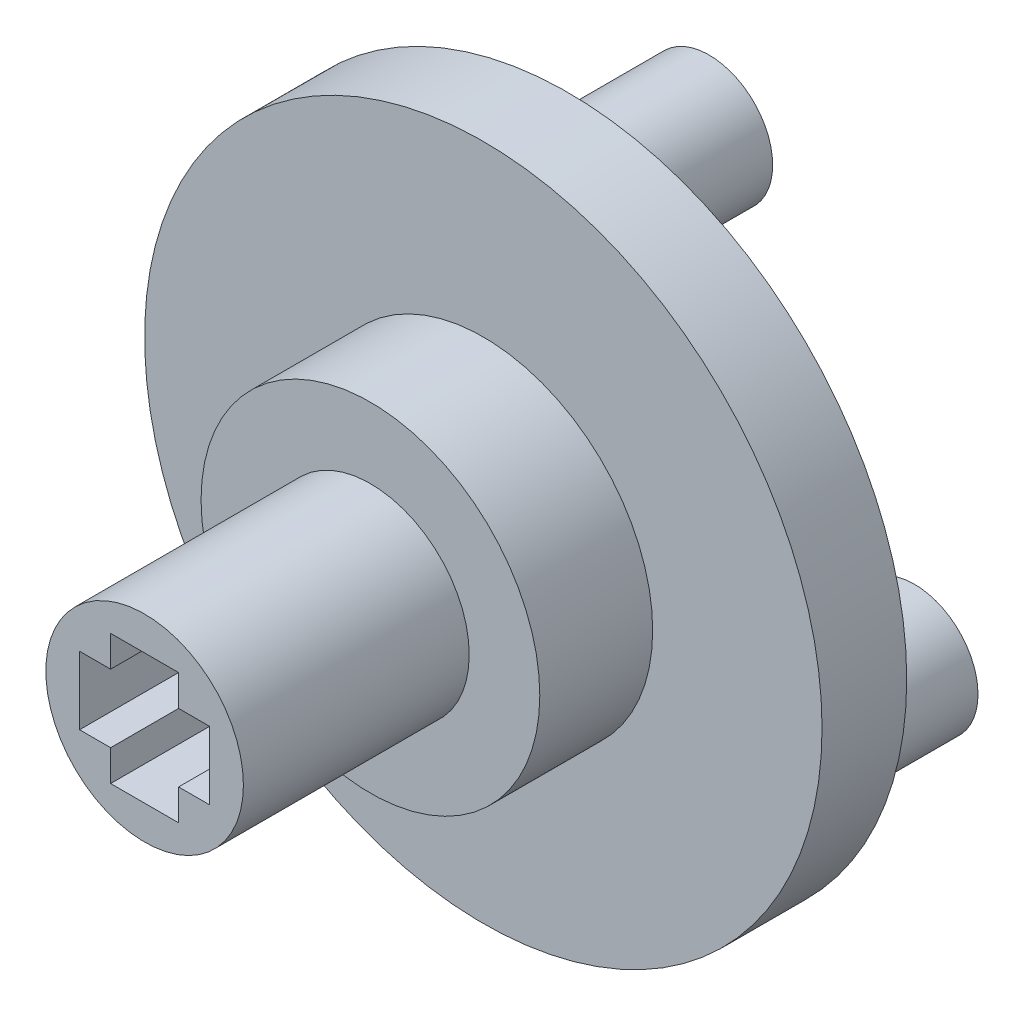
ISO-10303-21;
HEADER;
FILE_DESCRIPTION(('STEP AP214'),'2;1');
FILE_NAME('part.step','',(''),(''),'','','');
FILE_SCHEMA(('AUTOMOTIVE_DESIGN { 1 0 10303 214 1 1 1 1 }'));
ENDSEC;
DATA;
#1=APPLICATION_CONTEXT('core data for automotive mechanical design processes');
#2=APPLICATION_PROTOCOL_DEFINITION('international standard','automotive_design',2000,#1);
#3=PRODUCT_CONTEXT('',#1,'mechanical');
#4=PRODUCT('Part','Part','',(#3));
#5=PRODUCT_RELATED_PRODUCT_CATEGORY('part','',(#4));
#6=PRODUCT_DEFINITION_FORMATION('','',#4);
#7=PRODUCT_DEFINITION_CONTEXT('part definition',#1,'design');
#8=PRODUCT_DEFINITION('design','',#6,#7);
#9=PRODUCT_DEFINITION_SHAPE('','',#8);
#10=(LENGTH_UNIT() NAMED_UNIT(*) SI_UNIT(.MILLI.,.METRE.));
#11=(NAMED_UNIT(*) PLANE_ANGLE_UNIT() SI_UNIT($,.RADIAN.));
#12=(NAMED_UNIT(*) SI_UNIT($,.STERADIAN.) SOLID_ANGLE_UNIT());
#13=UNCERTAINTY_MEASURE_WITH_UNIT(LENGTH_MEASURE(1.E-05),#10,'distance_accuracy_value','');
#14=(GEOMETRIC_REPRESENTATION_CONTEXT(3) GLOBAL_UNCERTAINTY_ASSIGNED_CONTEXT((#13)) GLOBAL_UNIT_ASSIGNED_CONTEXT((#10,
#11,#12)) REPRESENTATION_CONTEXT('',''));
#15=CARTESIAN_POINT('',(0.,0.,0.));
#16=DIRECTION('',(0.,0.,1.));
#17=DIRECTION('',(1.,0.,0.));
#18=AXIS2_PLACEMENT_3D('',#15,#16,#17);
#19=CARTESIAN_POINT('',(0.,0.,3.));
#20=DIRECTION('',(0.,0.,1.));
#21=DIRECTION('',(1.,0.,0.));
#22=AXIS2_PLACEMENT_3D('',#19,#20,#21);
#23=PLANE('',#22);
#24=CARTESIAN_POINT('',(0.,0.,3.));
#25=DIRECTION('',(0.,0.,1.));
#26=DIRECTION('',(1.,0.,0.));
#27=AXIS2_PLACEMENT_3D('',#24,#25,#26);
#28=CIRCLE('',#27,12.);
#29=CARTESIAN_POINT('',(12.,0.,3.));
#30=VERTEX_POINT('',#29);
#31=EDGE_CURVE('E12',#30,#30,#28,.T.);
#32=ORIENTED_EDGE('',*,*,#31,.T.);
#33=EDGE_LOOP('',(#32));
#34=FACE_BOUND('',#33,.T.);
#35=CARTESIAN_POINT('',(0.,0.,3.));
#36=DIRECTION('',(0.,0.,1.));
#37=DIRECTION('',(1.,0.,0.));
#38=AXIS2_PLACEMENT_3D('',#35,#36,#37);
#39=CIRCLE('',#38,6.);
#40=CARTESIAN_POINT('',(6.,0.,3.));
#41=VERTEX_POINT('',#40);
#42=EDGE_CURVE('E267',#41,#41,#39,.T.);
#43=ORIENTED_EDGE('',*,*,#42,.F.);
#44=EDGE_LOOP('',(#43));
#45=FACE_BOUND('',#44,.T.);
#46=ADVANCED_FACE('F53',(#34,#45),#23,.T.);
#47=CARTESIAN_POINT('',(0.,0.,0.));
#48=DIRECTION('',(0.,0.,1.));
#49=DIRECTION('',(1.,0.,0.));
#50=AXIS2_PLACEMENT_3D('',#47,#48,#49);
#51=PLANE('',#50);
#52=CARTESIAN_POINT('',(-7.27461339178875,-4.20000000000031,0.));
#53=DIRECTION('',(0.,0.,1.));
#54=DIRECTION('',(1.,0.,0.));
#55=AXIS2_PLACEMENT_3D('',#52,#53,#54);
#56=CIRCLE('',#55,2.25000000000068);
#57=CARTESIAN_POINT('',(-5.02461339178807,-4.20000000000031,0.));
#58=VERTEX_POINT('',#57);
#59=EDGE_CURVE('E271',#58,#58,#56,.T.);
#60=ORIENTED_EDGE('',*,*,#59,.T.);
#61=EDGE_LOOP('',(#60));
#62=FACE_BOUND('',#61,.T.);
#63=CARTESIAN_POINT('',(7.27461339178982,-4.19999999999969,0.));
#64=DIRECTION('',(0.,0.,1.));
#65=DIRECTION('',(1.,0.,0.));
#66=AXIS2_PLACEMENT_3D('',#63,#64,#65);
#67=CIRCLE('',#66,2.25000000000046);
#68=CARTESIAN_POINT('',(9.52461339179028,-4.19999999999969,0.));
#69=VERTEX_POINT('',#68);
#70=EDGE_CURVE('E276',#69,#69,#67,.T.);
#71=ORIENTED_EDGE('',*,*,#70,.T.);
#72=EDGE_LOOP('',(#71));
#73=FACE_BOUND('',#72,.T.);
#74=CARTESIAN_POINT('',(0.,8.4,0.));
#75=DIRECTION('',(0.,0.,1.));
#76=DIRECTION('',(1.,0.,0.));
#77=AXIS2_PLACEMENT_3D('',#74,#75,#76);
#78=CIRCLE('',#77,2.25);
#79=CARTESIAN_POINT('',(2.25,8.4,0.));
#80=VERTEX_POINT('',#79);
#81=EDGE_CURVE('E284',#80,#80,#78,.T.);
#82=ORIENTED_EDGE('',*,*,#81,.T.);
#83=EDGE_LOOP('',(#82));
#84=FACE_BOUND('',#83,.T.);
#85=CARTESIAN_POINT('',(0.,0.,0.));
#86=DIRECTION('',(0.,0.,1.));
#87=DIRECTION('',(1.,0.,0.));
#88=AXIS2_PLACEMENT_3D('',#85,#86,#87);
#89=CIRCLE('',#88,12.);
#90=CARTESIAN_POINT('',(12.,0.,0.));
#91=VERTEX_POINT('',#90);
#92=EDGE_CURVE('E57',#91,#91,#89,.T.);
#93=ORIENTED_EDGE('',*,*,#92,.F.);
#94=EDGE_LOOP('',(#93));
#95=FACE_BOUND('',#94,.T.);
#96=CARTESIAN_POINT('',(0.,0.,0.));
#97=DIRECTION('',(0.,0.,1.));
#98=DIRECTION('',(1.,0.,0.));
#99=AXIS2_PLACEMENT_3D('',#96,#97,#98);
#100=CIRCLE('',#99,2.);
#101=CARTESIAN_POINT('',(2.,0.,0.));
#102=VERTEX_POINT('',#101);
#103=EDGE_CURVE('E292',#102,#102,#100,.T.);
#104=ORIENTED_EDGE('',*,*,#103,.T.);
#105=EDGE_LOOP('',(#104));
#106=FACE_BOUND('',#105,.T.);
#107=ADVANCED_FACE('F305',(#62,#73,#84,#95,#106),#51,.F.);
#108=CARTESIAN_POINT('',(0.,0.,3.));
#109=DIRECTION('',(0.,0.,-1.));
#110=DIRECTION('',(-1.,0.,0.));
#111=AXIS2_PLACEMENT_3D('',#108,#109,#110);
#112=CYLINDRICAL_SURFACE('',#111,12.);
#113=ORIENTED_EDGE('',*,*,#31,.F.);
#114=EDGE_LOOP('',(#113));
#115=FACE_BOUND('',#114,.T.);
#116=ORIENTED_EDGE('',*,*,#92,.T.);
#117=EDGE_LOOP('',(#116));
#118=FACE_BOUND('',#117,.T.);
#119=ADVANCED_FACE('F55',(#115,#118),#112,.T.);
#120=CARTESIAN_POINT('',(0.,0.,3.));
#121=DIRECTION('',(0.,0.,-1.));
#122=DIRECTION('',(-1.,0.,0.));
#123=AXIS2_PLACEMENT_3D('',#120,#121,#122);
#124=CYLINDRICAL_SURFACE('',#123,2.);
#125=ORIENTED_EDGE('',*,*,#103,.F.);
#126=EDGE_LOOP('',(#125));
#127=FACE_BOUND('',#126,.T.);
#128=CARTESIAN_POINT('',(0.,0.,6.));
#129=DIRECTION('',(0.,0.,1.));
#130=DIRECTION('',(1.,0.,0.));
#131=AXIS2_PLACEMENT_3D('',#128,#129,#130);
#132=CIRCLE('',#131,2.);
#133=CARTESIAN_POINT('',(2.,0.,6.));
#134=VERTEX_POINT('',#133);
#135=EDGE_CURVE('E263',#134,#134,#132,.T.);
#136=ORIENTED_EDGE('',*,*,#135,.T.);
#137=EDGE_LOOP('',(#136));
#138=FACE_BOUND('',#137,.T.);
#139=ADVANCED_FACE('F312',(#127,#138),#124,.F.);
#140=CARTESIAN_POINT('',(0.,8.4,-5.));
#141=DIRECTION('',(0.,0.,1.));
#142=DIRECTION('',(1.,0.,0.));
#143=AXIS2_PLACEMENT_3D('',#140,#141,#142);
#144=CYLINDRICAL_SURFACE('',#143,2.25);
#145=CARTESIAN_POINT('',(0.,8.4,-5.));
#146=DIRECTION('',(0.,0.,1.));
#147=DIRECTION('',(1.,0.,0.));
#148=AXIS2_PLACEMENT_3D('',#145,#146,#147);
#149=CIRCLE('',#148,2.25);
#150=CARTESIAN_POINT('',(2.25,8.4,-5.));
#151=VERTEX_POINT('',#150);
#152=EDGE_CURVE('E288',#151,#151,#149,.T.);
#153=ORIENTED_EDGE('',*,*,#152,.T.);
#154=EDGE_LOOP('',(#153));
#155=FACE_BOUND('',#154,.T.);
#156=ORIENTED_EDGE('',*,*,#81,.F.);
#157=EDGE_LOOP('',(#156));
#158=FACE_BOUND('',#157,.T.);
#159=ADVANCED_FACE('F320',(#155,#158),#144,.T.);
#160=CARTESIAN_POINT('',(0.,0.,-5.));
#161=DIRECTION('',(0.,0.,1.));
#162=DIRECTION('',(1.,0.,0.));
#163=AXIS2_PLACEMENT_3D('',#160,#161,#162);
#164=PLANE('',#163);
#165=ORIENTED_EDGE('',*,*,#152,.F.);
#166=EDGE_LOOP('',(#165));
#167=FACE_BOUND('',#166,.T.);
#168=ADVANCED_FACE('F324',(#167),#164,.F.);
#169=CARTESIAN_POINT('',(7.27461339178982,-4.19999999999969,-5.));
#170=DIRECTION('',(0.,0.,1.));
#171=DIRECTION('',(1.,0.,0.));
#172=AXIS2_PLACEMENT_3D('',#169,#170,#171);
#173=CYLINDRICAL_SURFACE('',#172,2.25000000000046);
#174=CARTESIAN_POINT('',(7.27461339178982,-4.19999999999969,-5.));
#175=DIRECTION('',(0.,0.,1.));
#176=DIRECTION('',(1.,0.,0.));
#177=AXIS2_PLACEMENT_3D('',#174,#175,#176);
#178=CIRCLE('',#177,2.25000000000046);
#179=CARTESIAN_POINT('',(9.52461339179028,-4.19999999999969,-5.));
#180=VERTEX_POINT('',#179);
#181=EDGE_CURVE('E280',#180,#180,#178,.T.);
#182=ORIENTED_EDGE('',*,*,#181,.T.);
#183=EDGE_LOOP('',(#182));
#184=FACE_BOUND('',#183,.T.);
#185=ORIENTED_EDGE('',*,*,#70,.F.);
#186=EDGE_LOOP('',(#185));
#187=FACE_BOUND('',#186,.T.);
#188=ADVANCED_FACE('F328',(#184,#187),#173,.T.);
#189=CARTESIAN_POINT('',(0.,0.,-5.));
#190=DIRECTION('',(0.,0.,1.));
#191=DIRECTION('',(1.,0.,0.));
#192=AXIS2_PLACEMENT_3D('',#189,#190,#191);
#193=PLANE('',#192);
#194=ORIENTED_EDGE('',*,*,#181,.F.);
#195=EDGE_LOOP('',(#194));
#196=FACE_BOUND('',#195,.T.);
#197=ADVANCED_FACE('F332',(#196),#193,.F.);
#198=CARTESIAN_POINT('',(-7.27461339178875,-4.20000000000031,-5.));
#199=DIRECTION('',(0.,0.,1.));
#200=DIRECTION('',(1.,0.,0.));
#201=AXIS2_PLACEMENT_3D('',#198,#199,#200);
#202=CYLINDRICAL_SURFACE('',#201,2.25000000000068);
#203=CARTESIAN_POINT('',(-7.27461339178875,-4.20000000000031,-5.));
#204=DIRECTION('',(0.,0.,1.));
#205=DIRECTION('',(1.,0.,0.));
#206=AXIS2_PLACEMENT_3D('',#203,#204,#205);
#207=CIRCLE('',#206,2.25000000000068);
#208=CARTESIAN_POINT('',(-5.02461339178807,-4.20000000000031,-5.));
#209=VERTEX_POINT('',#208);
#210=EDGE_CURVE('E272',#209,#209,#207,.T.);
#211=ORIENTED_EDGE('',*,*,#210,.T.);
#212=EDGE_LOOP('',(#211));
#213=FACE_BOUND('',#212,.T.);
#214=ORIENTED_EDGE('',*,*,#59,.F.);
#215=EDGE_LOOP('',(#214));
#216=FACE_BOUND('',#215,.T.);
#217=ADVANCED_FACE('F336',(#213,#216),#202,.T.);
#218=CARTESIAN_POINT('',(0.,0.,-5.));
#219=DIRECTION('',(0.,0.,1.));
#220=DIRECTION('',(1.,0.,0.));
#221=AXIS2_PLACEMENT_3D('',#218,#219,#220);
#222=PLANE('',#221);
#223=ORIENTED_EDGE('',*,*,#210,.F.);
#224=EDGE_LOOP('',(#223));
#225=FACE_BOUND('',#224,.T.);
#226=ADVANCED_FACE('F340',(#225),#222,.F.);
#227=CARTESIAN_POINT('',(0.,0.,6.));
#228=DIRECTION('',(0.,0.,-1.));
#229=DIRECTION('',(-1.,0.,0.));
#230=AXIS2_PLACEMENT_3D('',#227,#228,#229);
#231=CYLINDRICAL_SURFACE('',#230,6.);
#232=ORIENTED_EDGE('',*,*,#42,.T.);
#233=EDGE_LOOP('',(#232));
#234=FACE_BOUND('',#233,.T.);
#235=CARTESIAN_POINT('',(0.,0.,7.));
#236=DIRECTION('',(0.,0.,1.));
#237=DIRECTION('',(1.,0.,0.));
#238=AXIS2_PLACEMENT_3D('',#235,#236,#237);
#239=CIRCLE('',#238,6.);
#240=CARTESIAN_POINT('',(6.,0.,7.));
#241=VERTEX_POINT('',#240);
#242=EDGE_CURVE('E259',#241,#241,#239,.T.);
#243=ORIENTED_EDGE('',*,*,#242,.F.);
#244=EDGE_LOOP('',(#243));
#245=FACE_BOUND('',#244,.T.);
#246=ADVANCED_FACE('F344',(#234,#245),#231,.T.);
#247=CARTESIAN_POINT('',(0.,0.,6.));
#248=DIRECTION('',(0.,0.,1.));
#249=DIRECTION('',(1.,0.,0.));
#250=AXIS2_PLACEMENT_3D('',#247,#248,#249);
#251=PLANE('',#250);
#252=ORIENTED_EDGE('',*,*,#135,.F.);
#253=EDGE_LOOP('',(#252));
#254=FACE_BOUND('',#253,.T.);
#255=ADVANCED_FACE('F348',(#254),#251,.F.);
#256=CARTESIAN_POINT('',(0.,0.,7.));
#257=DIRECTION('',(0.,0.,1.));
#258=DIRECTION('',(1.,0.,0.));
#259=AXIS2_PLACEMENT_3D('',#256,#257,#258);
#260=PLANE('',#259);
#261=CARTESIAN_POINT('',(0.,0.,7.));
#262=DIRECTION('',(0.,0.,1.));
#263=DIRECTION('',(1.,0.,0.));
#264=AXIS2_PLACEMENT_3D('',#261,#262,#263);
#265=CIRCLE('',#264,3.5);
#266=CARTESIAN_POINT('',(3.5,0.,7.));
#267=VERTEX_POINT('',#266);
#268=EDGE_CURVE('E225',#267,#267,#265,.T.);
#269=ORIENTED_EDGE('',*,*,#268,.F.);
#270=EDGE_LOOP('',(#269));
#271=FACE_BOUND('',#270,.T.);
#272=ORIENTED_EDGE('',*,*,#242,.T.);
#273=EDGE_LOOP('',(#272));
#274=FACE_BOUND('',#273,.T.);
#275=ADVANCED_FACE('F352',(#271,#274),#260,.T.);
#276=CARTESIAN_POINT('',(0.,2.30428047928488,15.));
#277=DIRECTION('',(0.,1.,0.));
#278=DIRECTION('',(0.,0.,1.));
#279=AXIS2_PLACEMENT_3D('',#276,#277,#278);
#280=PLANE('',#279);
#281=DIRECTION('',(1.,0.,0.));
#282=VECTOR('',#281,1.);
#283=CARTESIAN_POINT('',(0.,2.30428047928488,7.));
#284=LINE('',#283,#282);
#285=CARTESIAN_POINT('',(-1.20428047928488,2.30428047928488,7.));
#286=VERTEX_POINT('',#285);
#287=CARTESIAN_POINT('',(1.20428047928488,2.30428047928488,7.));
#288=VERTEX_POINT('',#287);
#289=EDGE_CURVE('E182',#286,#288,#284,.T.);
#290=ORIENTED_EDGE('',*,*,#289,.T.);
#291=DIRECTION('',(0.,0.,-1.));
#292=VECTOR('',#291,1.);
#293=CARTESIAN_POINT('',(1.20428047928488,2.30428047928488,15.));
#294=LINE('',#293,#292);
#295=CARTESIAN_POINT('',(1.20428047928488,2.30428047928488,15.));
#296=VERTEX_POINT('',#295);
#297=EDGE_CURVE('E256',#296,#288,#294,.T.);
#298=ORIENTED_EDGE('',*,*,#297,.F.);
#299=DIRECTION('',(1.,0.,0.));
#300=VECTOR('',#299,1.);
#301=CARTESIAN_POINT('',(0.,2.30428047928488,15.));
#302=LINE('',#301,#300);
#303=CARTESIAN_POINT('',(-1.20428047928488,2.30428047928488,15.));
#304=VERTEX_POINT('',#303);
#305=EDGE_CURVE('E121',#304,#296,#302,.T.);
#306=ORIENTED_EDGE('',*,*,#305,.F.);
#307=DIRECTION('',(0.,0.,-1.));
#308=VECTOR('',#307,1.);
#309=CARTESIAN_POINT('',(-1.20428047928488,2.30428047928488,15.));
#310=LINE('',#309,#308);
#311=EDGE_CURVE('E181',#304,#286,#310,.T.);
#312=ORIENTED_EDGE('',*,*,#311,.T.);
#313=EDGE_LOOP('',(#290,#298,#306,#312));
#314=FACE_BOUND('',#313,.T.);
#315=ADVANCED_FACE('F356',(#314),#280,.F.);
#316=CARTESIAN_POINT('',(1.20428047928488,0.,15.));
#317=DIRECTION('',(-1.,0.,0.));
#318=DIRECTION('',(0.,0.,1.));
#319=AXIS2_PLACEMENT_3D('',#316,#317,#318);
#320=PLANE('',#319);
#321=DIRECTION('',(0.,1.,0.));
#322=VECTOR('',#321,1.);
#323=CARTESIAN_POINT('',(1.20428047928488,0.,7.));
#324=LINE('',#323,#322);
#325=CARTESIAN_POINT('',(1.20428047928488,1.20428047928488,7.));
#326=VERTEX_POINT('',#325);
#327=EDGE_CURVE('E186',#326,#288,#324,.T.);
#328=ORIENTED_EDGE('',*,*,#327,.F.);
#329=DIRECTION('',(0.,0.,-1.));
#330=VECTOR('',#329,1.);
#331=CARTESIAN_POINT('',(1.20428047928488,1.20428047928488,15.));
#332=LINE('',#331,#330);
#333=CARTESIAN_POINT('',(1.20428047928488,1.20428047928488,15.));
#334=VERTEX_POINT('',#333);
#335=EDGE_CURVE('E253',#334,#326,#332,.T.);
#336=ORIENTED_EDGE('',*,*,#335,.F.);
#337=DIRECTION('',(0.,1.,0.));
#338=VECTOR('',#337,1.);
#339=CARTESIAN_POINT('',(1.20428047928488,0.,15.));
#340=LINE('',#339,#338);
#341=EDGE_CURVE('E417',#334,#296,#340,.T.);
#342=ORIENTED_EDGE('',*,*,#341,.T.);
#343=ORIENTED_EDGE('',*,*,#297,.T.);
#344=EDGE_LOOP('',(#328,#336,#342,#343));
#345=FACE_BOUND('',#344,.T.);
#346=ADVANCED_FACE('F361',(#345),#320,.T.);
#347=CARTESIAN_POINT('',(0.,1.20428047928488,15.));
#348=DIRECTION('',(0.,1.,0.));
#349=DIRECTION('',(0.,0.,1.));
#350=AXIS2_PLACEMENT_3D('',#347,#348,#349);
#351=PLANE('',#350);
#352=DIRECTION('',(1.,0.,0.));
#353=VECTOR('',#352,1.);
#354=CARTESIAN_POINT('',(0.,1.20428047928488,7.));
#355=LINE('',#354,#353);
#356=CARTESIAN_POINT('',(2.30428047928488,1.20428047928488,7.));
#357=VERTEX_POINT('',#356);
#358=EDGE_CURVE('E190',#326,#357,#355,.T.);
#359=ORIENTED_EDGE('',*,*,#358,.T.);
#360=DIRECTION('',(0.,0.,-1.));
#361=VECTOR('',#360,1.);
#362=CARTESIAN_POINT('',(2.30428047928488,1.20428047928488,15.));
#363=LINE('',#362,#361);
#364=CARTESIAN_POINT('',(2.30428047928488,1.20428047928488,15.));
#365=VERTEX_POINT('',#364);
#366=EDGE_CURVE('E250',#365,#357,#363,.T.);
#367=ORIENTED_EDGE('',*,*,#366,.F.);
#368=DIRECTION('',(1.,0.,0.));
#369=VECTOR('',#368,1.);
#370=CARTESIAN_POINT('',(0.,1.20428047928488,15.));
#371=LINE('',#370,#369);
#372=EDGE_CURVE('E421',#334,#365,#371,.T.);
#373=ORIENTED_EDGE('',*,*,#372,.F.);
#374=ORIENTED_EDGE('',*,*,#335,.T.);
#375=EDGE_LOOP('',(#359,#367,#373,#374));
#376=FACE_BOUND('',#375,.T.);
#377=ADVANCED_FACE('F365',(#376),#351,.F.);
#378=CARTESIAN_POINT('',(2.30428047928488,0.,15.));
#379=DIRECTION('',(-1.,0.,0.));
#380=DIRECTION('',(0.,0.,1.));
#381=AXIS2_PLACEMENT_3D('',#378,#379,#380);
#382=PLANE('',#381);
#383=DIRECTION('',(0.,1.,0.));
#384=VECTOR('',#383,1.);
#385=CARTESIAN_POINT('',(2.30428047928488,0.,7.));
#386=LINE('',#385,#384);
#387=CARTESIAN_POINT('',(2.30428047928488,-1.20428047928488,7.));
#388=VERTEX_POINT('',#387);
#389=EDGE_CURVE('E194',#388,#357,#386,.T.);
#390=ORIENTED_EDGE('',*,*,#389,.F.);
#391=DIRECTION('',(0.,0.,-1.));
#392=VECTOR('',#391,1.);
#393=CARTESIAN_POINT('',(2.30428047928488,-1.20428047928488,15.));
#394=LINE('',#393,#392);
#395=CARTESIAN_POINT('',(2.30428047928488,-1.20428047928488,15.));
#396=VERTEX_POINT('',#395);
#397=EDGE_CURVE('E247',#396,#388,#394,.T.);
#398=ORIENTED_EDGE('',*,*,#397,.F.);
#399=DIRECTION('',(0.,1.,0.));
#400=VECTOR('',#399,1.);
#401=CARTESIAN_POINT('',(2.30428047928488,0.,15.));
#402=LINE('',#401,#400);
#403=EDGE_CURVE('E426',#396,#365,#402,.T.);
#404=ORIENTED_EDGE('',*,*,#403,.T.);
#405=ORIENTED_EDGE('',*,*,#366,.T.);
#406=EDGE_LOOP('',(#390,#398,#404,#405));
#407=FACE_BOUND('',#406,.T.);
#408=ADVANCED_FACE('F369',(#407),#382,.T.);
#409=CARTESIAN_POINT('',(0.,-1.20428047928488,15.));
#410=DIRECTION('',(0.,1.,0.));
#411=DIRECTION('',(0.,0.,1.));
#412=AXIS2_PLACEMENT_3D('',#409,#410,#411);
#413=PLANE('',#412);
#414=DIRECTION('',(1.,0.,0.));
#415=VECTOR('',#414,1.);
#416=CARTESIAN_POINT('',(0.,-1.20428047928488,7.));
#417=LINE('',#416,#415);
#418=CARTESIAN_POINT('',(1.20428047928488,-1.20428047928488,7.));
#419=VERTEX_POINT('',#418);
#420=EDGE_CURVE('E198',#419,#388,#417,.T.);
#421=ORIENTED_EDGE('',*,*,#420,.F.);
#422=DIRECTION('',(0.,0.,-1.));
#423=VECTOR('',#422,1.);
#424=CARTESIAN_POINT('',(1.20428047928488,-1.20428047928488,15.));
#425=LINE('',#424,#423);
#426=CARTESIAN_POINT('',(1.20428047928488,-1.20428047928488,15.));
#427=VERTEX_POINT('',#426);
#428=EDGE_CURVE('E244',#427,#419,#425,.T.);
#429=ORIENTED_EDGE('',*,*,#428,.F.);
#430=DIRECTION('',(1.,0.,0.));
#431=VECTOR('',#430,1.);
#432=CARTESIAN_POINT('',(0.,-1.20428047928488,15.));
#433=LINE('',#432,#431);
#434=EDGE_CURVE('E430',#427,#396,#433,.T.);
#435=ORIENTED_EDGE('',*,*,#434,.T.);
#436=ORIENTED_EDGE('',*,*,#397,.T.);
#437=EDGE_LOOP('',(#421,#429,#435,#436));
#438=FACE_BOUND('',#437,.T.);
#439=ADVANCED_FACE('F373',(#438),#413,.T.);
#440=CARTESIAN_POINT('',(1.20428047928488,0.,15.));
#441=DIRECTION('',(-1.,0.,0.));
#442=DIRECTION('',(0.,0.,1.));
#443=AXIS2_PLACEMENT_3D('',#440,#441,#442);
#444=PLANE('',#443);
#445=DIRECTION('',(0.,1.,0.));
#446=VECTOR('',#445,1.);
#447=CARTESIAN_POINT('',(1.20428047928488,0.,7.));
#448=LINE('',#447,#446);
#449=CARTESIAN_POINT('',(1.20428047928488,-2.30428047928488,7.));
#450=VERTEX_POINT('',#449);
#451=EDGE_CURVE('E202',#450,#419,#448,.T.);
#452=ORIENTED_EDGE('',*,*,#451,.F.);
#453=DIRECTION('',(0.,0.,-1.));
#454=VECTOR('',#453,1.);
#455=CARTESIAN_POINT('',(1.20428047928488,-2.30428047928488,15.));
#456=LINE('',#455,#454);
#457=CARTESIAN_POINT('',(1.20428047928488,-2.30428047928488,15.));
#458=VERTEX_POINT('',#457);
#459=EDGE_CURVE('E241',#458,#450,#456,.T.);
#460=ORIENTED_EDGE('',*,*,#459,.F.);
#461=DIRECTION('',(0.,1.,0.));
#462=VECTOR('',#461,1.);
#463=CARTESIAN_POINT('',(1.20428047928488,0.,15.));
#464=LINE('',#463,#462);
#465=EDGE_CURVE('E434',#458,#427,#464,.T.);
#466=ORIENTED_EDGE('',*,*,#465,.T.);
#467=ORIENTED_EDGE('',*,*,#428,.T.);
#468=EDGE_LOOP('',(#452,#460,#466,#467));
#469=FACE_BOUND('',#468,.T.);
#470=ADVANCED_FACE('F377',(#469),#444,.T.);
#471=CARTESIAN_POINT('',(0.,-2.30428047928488,15.));
#472=DIRECTION('',(0.,1.,0.));
#473=DIRECTION('',(0.,0.,1.));
#474=AXIS2_PLACEMENT_3D('',#471,#472,#473);
#475=PLANE('',#474);
#476=DIRECTION('',(1.,0.,0.));
#477=VECTOR('',#476,1.);
#478=CARTESIAN_POINT('',(0.,-2.30428047928488,7.));
#479=LINE('',#478,#477);
#480=CARTESIAN_POINT('',(-1.20428047928488,-2.30428047928488,7.));
#481=VERTEX_POINT('',#480);
#482=EDGE_CURVE('E206',#481,#450,#479,.T.);
#483=ORIENTED_EDGE('',*,*,#482,.F.);
#484=DIRECTION('',(0.,0.,-1.));
#485=VECTOR('',#484,1.);
#486=CARTESIAN_POINT('',(-1.20428047928488,-2.30428047928488,15.));
#487=LINE('',#486,#485);
#488=CARTESIAN_POINT('',(-1.20428047928488,-2.30428047928488,15.));
#489=VERTEX_POINT('',#488);
#490=EDGE_CURVE('E238',#489,#481,#487,.T.);
#491=ORIENTED_EDGE('',*,*,#490,.F.);
#492=DIRECTION('',(1.,0.,0.));
#493=VECTOR('',#492,1.);
#494=CARTESIAN_POINT('',(0.,-2.30428047928488,15.));
#495=LINE('',#494,#493);
#496=EDGE_CURVE('E438',#489,#458,#495,.T.);
#497=ORIENTED_EDGE('',*,*,#496,.T.);
#498=ORIENTED_EDGE('',*,*,#459,.T.);
#499=EDGE_LOOP('',(#483,#491,#497,#498));
#500=FACE_BOUND('',#499,.T.);
#501=ADVANCED_FACE('F381',(#500),#475,.T.);
#502=CARTESIAN_POINT('',(-1.20428047928488,0.,15.));
#503=DIRECTION('',(-1.,0.,0.));
#504=DIRECTION('',(0.,0.,1.));
#505=AXIS2_PLACEMENT_3D('',#502,#503,#504);
#506=PLANE('',#505);
#507=DIRECTION('',(0.,1.,0.));
#508=VECTOR('',#507,1.);
#509=CARTESIAN_POINT('',(-1.20428047928488,0.,7.));
#510=LINE('',#509,#508);
#511=CARTESIAN_POINT('',(-1.20428047928488,-1.20428047928488,7.));
#512=VERTEX_POINT('',#511);
#513=EDGE_CURVE('E210',#481,#512,#510,.T.);
#514=ORIENTED_EDGE('',*,*,#513,.T.);
#515=DIRECTION('',(0.,0.,-1.));
#516=VECTOR('',#515,1.);
#517=CARTESIAN_POINT('',(-1.20428047928488,-1.20428047928488,15.));
#518=LINE('',#517,#516);
#519=CARTESIAN_POINT('',(-1.20428047928488,-1.20428047928488,15.));
#520=VERTEX_POINT('',#519);
#521=EDGE_CURVE('E235',#520,#512,#518,.T.);
#522=ORIENTED_EDGE('',*,*,#521,.F.);
#523=DIRECTION('',(0.,1.,0.));
#524=VECTOR('',#523,1.);
#525=CARTESIAN_POINT('',(-1.20428047928488,0.,15.));
#526=LINE('',#525,#524);
#527=EDGE_CURVE('E442',#489,#520,#526,.T.);
#528=ORIENTED_EDGE('',*,*,#527,.F.);
#529=ORIENTED_EDGE('',*,*,#490,.T.);
#530=EDGE_LOOP('',(#514,#522,#528,#529));
#531=FACE_BOUND('',#530,.T.);
#532=ADVANCED_FACE('F385',(#531),#506,.F.);
#533=CARTESIAN_POINT('',(0.,-1.20428047928488,15.));
#534=DIRECTION('',(0.,1.,0.));
#535=DIRECTION('',(0.,0.,1.));
#536=AXIS2_PLACEMENT_3D('',#533,#534,#535);
#537=PLANE('',#536);
#538=DIRECTION('',(1.,0.,0.));
#539=VECTOR('',#538,1.);
#540=CARTESIAN_POINT('',(0.,-1.20428047928488,7.));
#541=LINE('',#540,#539);
#542=CARTESIAN_POINT('',(-2.30428047928488,-1.20428047928488,7.));
#543=VERTEX_POINT('',#542);
#544=EDGE_CURVE('E214',#543,#512,#541,.T.);
#545=ORIENTED_EDGE('',*,*,#544,.F.);
#546=DIRECTION('',(0.,0.,-1.));
#547=VECTOR('',#546,1.);
#548=CARTESIAN_POINT('',(-2.30428047928488,-1.20428047928488,15.));
#549=LINE('',#548,#547);
#550=CARTESIAN_POINT('',(-2.30428047928488,-1.20428047928488,15.));
#551=VERTEX_POINT('',#550);
#552=EDGE_CURVE('E168',#551,#543,#549,.T.);
#553=ORIENTED_EDGE('',*,*,#552,.F.);
#554=DIRECTION('',(1.,0.,0.));
#555=VECTOR('',#554,1.);
#556=CARTESIAN_POINT('',(0.,-1.20428047928488,15.));
#557=LINE('',#556,#555);
#558=EDGE_CURVE('E156',#551,#520,#557,.T.);
#559=ORIENTED_EDGE('',*,*,#558,.T.);
#560=ORIENTED_EDGE('',*,*,#521,.T.);
#561=EDGE_LOOP('',(#545,#553,#559,#560));
#562=FACE_BOUND('',#561,.T.);
#563=ADVANCED_FACE('F389',(#562),#537,.T.);
#564=CARTESIAN_POINT('',(-2.30428047928488,0.,15.));
#565=DIRECTION('',(-1.,0.,0.));
#566=DIRECTION('',(0.,0.,1.));
#567=AXIS2_PLACEMENT_3D('',#564,#565,#566);
#568=PLANE('',#567);
#569=DIRECTION('',(0.,1.,0.));
#570=VECTOR('',#569,1.);
#571=CARTESIAN_POINT('',(-2.30428047928488,0.,7.));
#572=LINE('',#571,#570);
#573=CARTESIAN_POINT('',(-2.30428047928488,1.20428047928488,7.));
#574=VERTEX_POINT('',#573);
#575=EDGE_CURVE('E164',#543,#574,#572,.T.);
#576=ORIENTED_EDGE('',*,*,#575,.T.);
#577=DIRECTION('',(0.,0.,-1.));
#578=VECTOR('',#577,1.);
#579=CARTESIAN_POINT('',(-2.30428047928488,1.20428047928488,15.));
#580=LINE('',#579,#578);
#581=CARTESIAN_POINT('',(-2.30428047928488,1.20428047928488,15.));
#582=VERTEX_POINT('',#581);
#583=EDGE_CURVE('E161',#582,#574,#580,.T.);
#584=ORIENTED_EDGE('',*,*,#583,.F.);
#585=DIRECTION('',(0.,1.,0.));
#586=VECTOR('',#585,1.);
#587=CARTESIAN_POINT('',(-2.30428047928488,0.,15.));
#588=LINE('',#587,#586);
#589=EDGE_CURVE('E149',#551,#582,#588,.T.);
#590=ORIENTED_EDGE('',*,*,#589,.F.);
#591=ORIENTED_EDGE('',*,*,#552,.T.);
#592=EDGE_LOOP('',(#576,#584,#590,#591));
#593=FACE_BOUND('',#592,.T.);
#594=ADVANCED_FACE('F162',(#593),#568,.F.);
#595=CARTESIAN_POINT('',(0.,1.20428047928488,15.));
#596=DIRECTION('',(0.,1.,0.));
#597=DIRECTION('',(0.,0.,1.));
#598=AXIS2_PLACEMENT_3D('',#595,#596,#597);
#599=PLANE('',#598);
#600=DIRECTION('',(1.,0.,0.));
#601=VECTOR('',#600,1.);
#602=CARTESIAN_POINT('',(0.,1.20428047928488,7.));
#603=LINE('',#602,#601);
#604=CARTESIAN_POINT('',(-1.20428047928488,1.20428047928488,7.));
#605=VERTEX_POINT('',#604);
#606=EDGE_CURVE('E220',#574,#605,#603,.T.);
#607=ORIENTED_EDGE('',*,*,#606,.T.);
#608=DIRECTION('',(0.,0.,-1.));
#609=VECTOR('',#608,1.);
#610=CARTESIAN_POINT('',(-1.20428047928488,1.20428047928488,15.));
#611=LINE('',#610,#609);
#612=CARTESIAN_POINT('',(-1.20428047928488,1.20428047928488,15.));
#613=VERTEX_POINT('',#612);
#614=EDGE_CURVE('E69',#613,#605,#611,.T.);
#615=ORIENTED_EDGE('',*,*,#614,.F.);
#616=DIRECTION('',(1.,0.,0.));
#617=VECTOR('',#616,1.);
#618=CARTESIAN_POINT('',(0.,1.20428047928488,15.));
#619=LINE('',#618,#617);
#620=EDGE_CURVE('E154',#582,#613,#619,.T.);
#621=ORIENTED_EDGE('',*,*,#620,.F.);
#622=ORIENTED_EDGE('',*,*,#583,.T.);
#623=EDGE_LOOP('',(#607,#615,#621,#622));
#624=FACE_BOUND('',#623,.T.);
#625=ADVANCED_FACE('F170',(#624),#599,.F.);
#626=CARTESIAN_POINT('',(-1.20428047928488,0.,15.));
#627=DIRECTION('',(-1.,0.,0.));
#628=DIRECTION('',(0.,0.,1.));
#629=AXIS2_PLACEMENT_3D('',#626,#627,#628);
#630=PLANE('',#629);
#631=DIRECTION('',(0.,1.,0.));
#632=VECTOR('',#631,1.);
#633=CARTESIAN_POINT('',(-1.20428047928488,0.,7.));
#634=LINE('',#633,#632);
#635=EDGE_CURVE('E115',#605,#286,#634,.T.);
#636=ORIENTED_EDGE('',*,*,#635,.T.);
#637=ORIENTED_EDGE('',*,*,#311,.F.);
#638=DIRECTION('',(0.,1.,0.));
#639=VECTOR('',#638,1.);
#640=CARTESIAN_POINT('',(-1.20428047928488,0.,15.));
#641=LINE('',#640,#639);
#642=EDGE_CURVE('E77',#613,#304,#641,.T.);
#643=ORIENTED_EDGE('',*,*,#642,.F.);
#644=ORIENTED_EDGE('',*,*,#614,.T.);
#645=EDGE_LOOP('',(#636,#637,#643,#644));
#646=FACE_BOUND('',#645,.T.);
#647=ADVANCED_FACE('F398',(#646),#630,.F.);
#648=CARTESIAN_POINT('',(0.,0.,15.));
#649=DIRECTION('',(0.,0.,-1.));
#650=DIRECTION('',(-1.,0.,0.));
#651=AXIS2_PLACEMENT_3D('',#648,#649,#650);
#652=CYLINDRICAL_SURFACE('',#651,3.5);
#653=CARTESIAN_POINT('',(0.,0.,15.));
#654=DIRECTION('',(0.,0.,1.));
#655=DIRECTION('',(1.,0.,0.));
#656=AXIS2_PLACEMENT_3D('',#653,#654,#655);
#657=CIRCLE('',#656,3.5);
#658=CARTESIAN_POINT('',(3.5,0.,15.));
#659=VERTEX_POINT('',#658);
#660=EDGE_CURVE('E174',#659,#659,#657,.T.);
#661=ORIENTED_EDGE('',*,*,#660,.F.);
#662=EDGE_LOOP('',(#661));
#663=FACE_BOUND('',#662,.T.);
#664=ORIENTED_EDGE('',*,*,#268,.T.);
#665=EDGE_LOOP('',(#664));
#666=FACE_BOUND('',#665,.T.);
#667=ADVANCED_FACE('F401',(#663,#666),#652,.T.);
#668=CARTESIAN_POINT('',(0.,0.,15.));
#669=DIRECTION('',(0.,0.,1.));
#670=DIRECTION('',(1.,0.,0.));
#671=AXIS2_PLACEMENT_3D('',#668,#669,#670);
#672=PLANE('',#671);
#673=ORIENTED_EDGE('',*,*,#305,.T.);
#674=ORIENTED_EDGE('',*,*,#341,.F.);
#675=ORIENTED_EDGE('',*,*,#372,.T.);
#676=ORIENTED_EDGE('',*,*,#403,.F.);
#677=ORIENTED_EDGE('',*,*,#434,.F.);
#678=ORIENTED_EDGE('',*,*,#465,.F.);
#679=ORIENTED_EDGE('',*,*,#496,.F.);
#680=ORIENTED_EDGE('',*,*,#527,.T.);
#681=ORIENTED_EDGE('',*,*,#558,.F.);
#682=ORIENTED_EDGE('',*,*,#589,.T.);
#683=ORIENTED_EDGE('',*,*,#620,.T.);
#684=ORIENTED_EDGE('',*,*,#642,.T.);
#685=EDGE_LOOP('',(#673,#674,#675,#676,#677,#678,#679,#680,#681,#682,#683,#684));
#686=FACE_BOUND('',#685,.T.);
#687=ORIENTED_EDGE('',*,*,#660,.T.);
#688=EDGE_LOOP('',(#687));
#689=FACE_BOUND('',#688,.T.);
#690=ADVANCED_FACE('F151',(#686,#689),#672,.T.);
#691=ORIENTED_EDGE('',*,*,#327,.T.);
#692=ORIENTED_EDGE('',*,*,#289,.F.);
#693=ORIENTED_EDGE('',*,*,#635,.F.);
#694=ORIENTED_EDGE('',*,*,#606,.F.);
#695=ORIENTED_EDGE('',*,*,#575,.F.);
#696=ORIENTED_EDGE('',*,*,#544,.T.);
#697=ORIENTED_EDGE('',*,*,#513,.F.);
#698=ORIENTED_EDGE('',*,*,#482,.T.);
#699=ORIENTED_EDGE('',*,*,#451,.T.);
#700=ORIENTED_EDGE('',*,*,#420,.T.);
#701=ORIENTED_EDGE('',*,*,#389,.T.);
#702=ORIENTED_EDGE('',*,*,#358,.F.);
#703=EDGE_LOOP('',(#691,#692,#693,#694,#695,#696,#697,#698,#699,#700,#701,#702));
#704=FACE_BOUND('',#703,.T.);
#705=ADVANCED_FACE('F358',(#704),#260,.T.);
#706=CLOSED_SHELL('',(#46,#107,#119,#139,#159,#168,#188,#197,#217,#226,#246,#255,#275,#315,#346,
#377,#408,#439,#470,#501,#532,#563,#594,#625,#647,#667,#690,#705));
#707=MANIFOLD_SOLID_BREP('B2',#706);
#708=ADVANCED_BREP_SHAPE_REPRESENTATION('',(#18,#707),#14);
#709=SHAPE_DEFINITION_REPRESENTATION(#9,#708);
ENDSEC;
END-ISO-10303-21;
